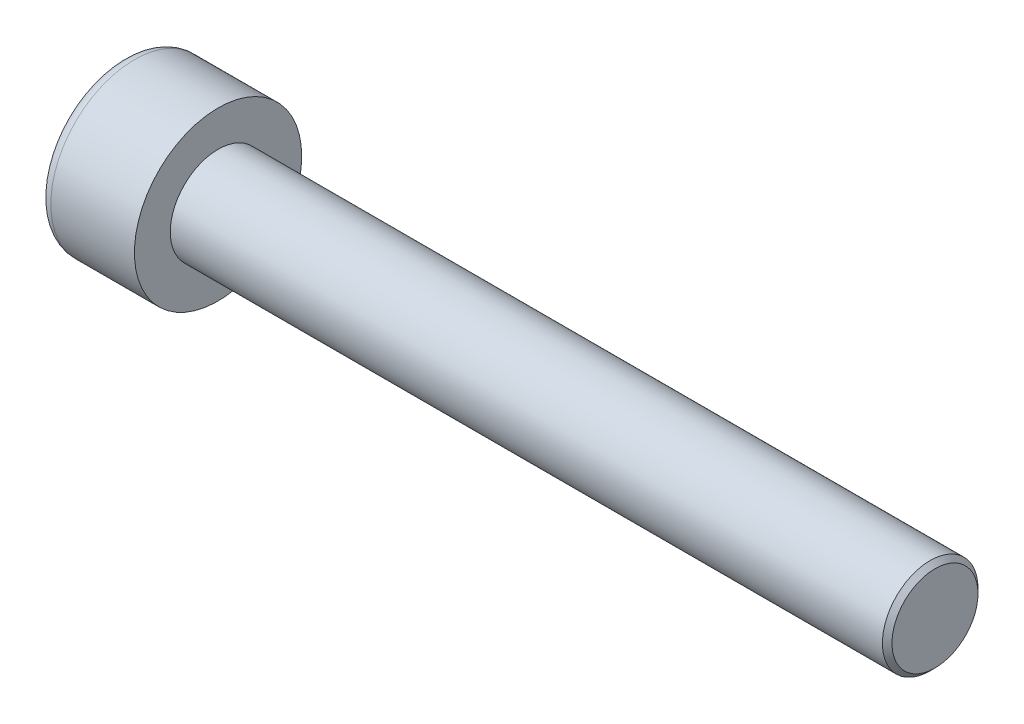
ISO-10303-21;
HEADER;
FILE_DESCRIPTION(('STEP AP214'),'2;1');
FILE_NAME('part.step','',(''),(''),'','','');
FILE_SCHEMA(('AUTOMOTIVE_DESIGN { 1 0 10303 214 1 1 1 1 }'));
ENDSEC;
DATA;
#1=APPLICATION_CONTEXT('core data for automotive mechanical design processes');
#2=APPLICATION_PROTOCOL_DEFINITION('international standard','automotive_design',2000,#1);
#3=PRODUCT_CONTEXT('',#1,'mechanical');
#4=PRODUCT('Part','Part','',(#3));
#5=PRODUCT_RELATED_PRODUCT_CATEGORY('part','',(#4));
#6=PRODUCT_DEFINITION_FORMATION('','',#4);
#7=PRODUCT_DEFINITION_CONTEXT('part definition',#1,'design');
#8=PRODUCT_DEFINITION('design','',#6,#7);
#9=PRODUCT_DEFINITION_SHAPE('','',#8);
#10=(LENGTH_UNIT() NAMED_UNIT(*) SI_UNIT(.MILLI.,.METRE.));
#11=(NAMED_UNIT(*) PLANE_ANGLE_UNIT() SI_UNIT($,.RADIAN.));
#12=(NAMED_UNIT(*) SI_UNIT($,.STERADIAN.) SOLID_ANGLE_UNIT());
#13=UNCERTAINTY_MEASURE_WITH_UNIT(LENGTH_MEASURE(1.E-05),#10,'distance_accuracy_value','');
#14=(GEOMETRIC_REPRESENTATION_CONTEXT(3) GLOBAL_UNCERTAINTY_ASSIGNED_CONTEXT((#13)) GLOBAL_UNIT_ASSIGNED_CONTEXT((#10,
#11,#12)) REPRESENTATION_CONTEXT('',''));
#15=CARTESIAN_POINT('',(0.,0.,0.));
#16=DIRECTION('',(0.,0.,1.));
#17=DIRECTION('',(1.,0.,0.));
#18=AXIS2_PLACEMENT_3D('',#15,#16,#17);
#19=CARTESIAN_POINT('',(2.,1.5,-2.59807621135331));
#20=DIRECTION('',(1.,0.,0.));
#21=DIRECTION('',(0.,0.,-1.));
#22=AXIS2_PLACEMENT_3D('',#19,#20,#21);
#23=PLANE('',#22);
#24=CARTESIAN_POINT('',(2.,0.,0.));
#25=DIRECTION('',(1.,0.,0.));
#26=DIRECTION('',(0.,0.,-1.));
#27=AXIS2_PLACEMENT_3D('',#24,#25,#26);
#28=CIRCLE('',#27,1.5);
#29=CARTESIAN_POINT('',(2.,-0.75,-1.29903810567666));
#30=VERTEX_POINT('',#29);
#31=CARTESIAN_POINT('',(2.,-1.5,0.));
#32=VERTEX_POINT('',#31);
#33=EDGE_CURVE('E172',#30,#32,#28,.F.);
#34=ORIENTED_EDGE('',*,*,#33,.F.);
#35=DIRECTION('',(0.,0.866025403784439,-0.5));
#36=VECTOR('',#35,1.);
#37=CARTESIAN_POINT('',(2.,-1.5,-0.866025403784437));
#38=LINE('',#37,#36);
#39=CARTESIAN_POINT('',(2.,-1.5,-0.866025403784437));
#40=VERTEX_POINT('',#39);
#41=EDGE_CURVE('E181',#40,#30,#38,.T.);
#42=ORIENTED_EDGE('',*,*,#41,.F.);
#43=DIRECTION('',(0.,0.,-1.));
#44=VECTOR('',#43,1.);
#45=CARTESIAN_POINT('',(2.,-1.5,0.86602540378444));
#46=LINE('',#45,#44);
#47=EDGE_CURVE('E203',#32,#40,#46,.T.);
#48=ORIENTED_EDGE('',*,*,#47,.F.);
#49=EDGE_LOOP('',(#34,#42,#48));
#50=FACE_BOUND('',#49,.T.);
#51=ADVANCED_FACE('F47',(#50),#23,.F.);
#52=CARTESIAN_POINT('',(2.,-0.75,1.29903810567666));
#53=VERTEX_POINT('',#52);
#54=EDGE_CURVE('E330',#32,#53,#28,.F.);
#55=ORIENTED_EDGE('',*,*,#54,.F.);
#56=CARTESIAN_POINT('',(2.,-1.5,0.86602540378444));
#57=VERTEX_POINT('',#56);
#58=EDGE_CURVE('E204',#57,#32,#46,.T.);
#59=ORIENTED_EDGE('',*,*,#58,.F.);
#60=DIRECTION('',(0.,-0.866025403784438,-0.5));
#61=VECTOR('',#60,1.);
#62=CARTESIAN_POINT('',(2.,0.,1.73205080756888));
#63=LINE('',#62,#61);
#64=EDGE_CURVE('E198',#53,#57,#63,.T.);
#65=ORIENTED_EDGE('',*,*,#64,.F.);
#66=EDGE_LOOP('',(#55,#59,#65));
#67=FACE_BOUND('',#66,.T.);
#68=ADVANCED_FACE('F137',(#67),#23,.F.);
#69=CARTESIAN_POINT('',(2.,0.75,1.29903810567666));
#70=VERTEX_POINT('',#69);
#71=EDGE_CURVE('E328',#53,#70,#28,.F.);
#72=ORIENTED_EDGE('',*,*,#71,.F.);
#73=CARTESIAN_POINT('',(2.,0.,1.73205080756888));
#74=VERTEX_POINT('',#73);
#75=EDGE_CURVE('E199',#74,#53,#63,.T.);
#76=ORIENTED_EDGE('',*,*,#75,.F.);
#77=DIRECTION('',(0.,-0.866025403784438,0.5));
#78=VECTOR('',#77,1.);
#79=CARTESIAN_POINT('',(2.,1.5,0.86602540378444));
#80=LINE('',#79,#78);
#81=EDGE_CURVE('E193',#70,#74,#80,.T.);
#82=ORIENTED_EDGE('',*,*,#81,.F.);
#83=EDGE_LOOP('',(#72,#76,#82));
#84=FACE_BOUND('',#83,.T.);
#85=ADVANCED_FACE('F143',(#84),#23,.F.);
#86=CARTESIAN_POINT('',(2.,1.5,0.));
#87=VERTEX_POINT('',#86);
#88=EDGE_CURVE('E169',#70,#87,#28,.F.);
#89=ORIENTED_EDGE('',*,*,#88,.F.);
#90=CARTESIAN_POINT('',(2.,1.5,0.86602540378444));
#91=VERTEX_POINT('',#90);
#92=EDGE_CURVE('E194',#91,#70,#80,.T.);
#93=ORIENTED_EDGE('',*,*,#92,.F.);
#94=DIRECTION('',(0.,0.,1.));
#95=VECTOR('',#94,1.);
#96=CARTESIAN_POINT('',(2.,1.5,-0.866025403784437));
#97=LINE('',#96,#95);
#98=EDGE_CURVE('E186',#87,#91,#97,.T.);
#99=ORIENTED_EDGE('',*,*,#98,.F.);
#100=EDGE_LOOP('',(#89,#93,#99));
#101=FACE_BOUND('',#100,.T.);
#102=ADVANCED_FACE('F157',(#101),#23,.F.);
#103=CARTESIAN_POINT('',(2.,0.,0.));
#104=DIRECTION('',(1.,0.,0.));
#105=DIRECTION('',(0.,0.,-1.));
#106=AXIS2_PLACEMENT_3D('',#103,#104,#105);
#107=CIRCLE('',#106,1.5);
#108=CARTESIAN_POINT('',(2.,0.749999999999999,-1.29903810567666));
#109=VERTEX_POINT('',#108);
#110=EDGE_CURVE('E63',#109,#87,#107,.T.);
#111=ORIENTED_EDGE('',*,*,#110,.T.);
#112=CARTESIAN_POINT('',(2.,1.5,-0.866025403784437));
#113=VERTEX_POINT('',#112);
#114=EDGE_CURVE('E177',#113,#87,#97,.T.);
#115=ORIENTED_EDGE('',*,*,#114,.F.);
#116=DIRECTION('',(0.,0.866025403784438,0.5));
#117=VECTOR('',#116,1.);
#118=CARTESIAN_POINT('',(2.,0.,-1.73205080756888));
#119=LINE('',#118,#117);
#120=EDGE_CURVE('E174',#109,#113,#119,.T.);
#121=ORIENTED_EDGE('',*,*,#120,.F.);
#122=EDGE_LOOP('',(#111,#115,#121));
#123=FACE_BOUND('',#122,.T.);
#124=ADVANCED_FACE('F148',(#123),#23,.F.);
#125=EDGE_CURVE('E161',#109,#30,#28,.F.);
#126=ORIENTED_EDGE('',*,*,#125,.F.);
#127=CARTESIAN_POINT('',(2.,0.,-1.73205080756888));
#128=VERTEX_POINT('',#127);
#129=EDGE_CURVE('E164',#128,#109,#119,.T.);
#130=ORIENTED_EDGE('',*,*,#129,.F.);
#131=EDGE_CURVE('E166',#30,#128,#38,.T.);
#132=ORIENTED_EDGE('',*,*,#131,.F.);
#133=EDGE_LOOP('',(#126,#130,#132));
#134=FACE_BOUND('',#133,.T.);
#135=ADVANCED_FACE('F139',(#134),#23,.F.);
#136=CARTESIAN_POINT('',(0.,0.,0.));
#137=DIRECTION('',(1.,0.,0.));
#138=DIRECTION('',(0.,0.,-1.));
#139=AXIS2_PLACEMENT_3D('',#136,#137,#138);
#140=PLANE('',#139);
#141=CARTESIAN_POINT('',(0.,0.,0.));
#142=DIRECTION('',(1.,0.,0.));
#143=DIRECTION('',(0.,0.,-1.));
#144=AXIS2_PLACEMENT_3D('',#141,#142,#143);
#145=CIRCLE('',#144,3.);
#146=CARTESIAN_POINT('',(0.,0.,-3.));
#147=VERTEX_POINT('',#146);
#148=EDGE_CURVE('E258',#147,#147,#145,.F.);
#149=ORIENTED_EDGE('',*,*,#148,.T.);
#150=EDGE_LOOP('',(#149));
#151=FACE_BOUND('',#150,.T.);
#152=DIRECTION('',(0.,0.866025403784439,-0.5));
#153=VECTOR('',#152,1.);
#154=CARTESIAN_POINT('',(0.,-1.5,-0.866025403784437));
#155=LINE('',#154,#153);
#156=CARTESIAN_POINT('',(0.,-1.5,-0.866025403784437));
#157=VERTEX_POINT('',#156);
#158=CARTESIAN_POINT('',(0.,0.,-1.73205080756888));
#159=VERTEX_POINT('',#158);
#160=EDGE_CURVE('E71',#157,#159,#155,.T.);
#161=ORIENTED_EDGE('',*,*,#160,.T.);
#162=DIRECTION('',(0.,0.866025403784438,0.5));
#163=VECTOR('',#162,1.);
#164=CARTESIAN_POINT('',(0.,0.,-1.73205080756888));
#165=LINE('',#164,#163);
#166=CARTESIAN_POINT('',(0.,1.5,-0.866025403784437));
#167=VERTEX_POINT('',#166);
#168=EDGE_CURVE('E211',#159,#167,#165,.T.);
#169=ORIENTED_EDGE('',*,*,#168,.T.);
#170=DIRECTION('',(0.,0.,1.));
#171=VECTOR('',#170,1.);
#172=CARTESIAN_POINT('',(0.,1.5,-0.866025403784437));
#173=LINE('',#172,#171);
#174=CARTESIAN_POINT('',(0.,1.5,0.86602540378444));
#175=VERTEX_POINT('',#174);
#176=EDGE_CURVE('E215',#167,#175,#173,.T.);
#177=ORIENTED_EDGE('',*,*,#176,.T.);
#178=DIRECTION('',(0.,-0.866025403784438,0.5));
#179=VECTOR('',#178,1.);
#180=CARTESIAN_POINT('',(0.,1.5,0.86602540378444));
#181=LINE('',#180,#179);
#182=CARTESIAN_POINT('',(0.,0.,1.73205080756888));
#183=VERTEX_POINT('',#182);
#184=EDGE_CURVE('E219',#175,#183,#181,.T.);
#185=ORIENTED_EDGE('',*,*,#184,.T.);
#186=DIRECTION('',(0.,-0.866025403784438,-0.5));
#187=VECTOR('',#186,1.);
#188=CARTESIAN_POINT('',(0.,0.,1.73205080756888));
#189=LINE('',#188,#187);
#190=CARTESIAN_POINT('',(0.,-1.5,0.86602540378444));
#191=VERTEX_POINT('',#190);
#192=EDGE_CURVE('E223',#183,#191,#189,.T.);
#193=ORIENTED_EDGE('',*,*,#192,.T.);
#194=DIRECTION('',(0.,0.,-1.));
#195=VECTOR('',#194,1.);
#196=CARTESIAN_POINT('',(0.,-1.5,0.86602540378444));
#197=LINE('',#196,#195);
#198=EDGE_CURVE('E227',#191,#157,#197,.T.);
#199=ORIENTED_EDGE('',*,*,#198,.T.);
#200=EDGE_LOOP('',(#161,#169,#177,#185,#193,#199));
#201=FACE_BOUND('',#200,.T.);
#202=ADVANCED_FACE('F147',(#151,#201),#140,.F.);
#203=CARTESIAN_POINT('',(4.,0.,0.));
#204=DIRECTION('',(1.,0.,0.));
#205=DIRECTION('',(0.,0.,-1.));
#206=AXIS2_PLACEMENT_3D('',#203,#204,#205);
#207=PLANE('',#206);
#208=CARTESIAN_POINT('',(4.,0.,0.));
#209=DIRECTION('',(1.,0.,0.));
#210=DIRECTION('',(0.,0.,-1.));
#211=AXIS2_PLACEMENT_3D('',#208,#209,#210);
#212=CIRCLE('',#211,3.5);
#213=CARTESIAN_POINT('',(4.,0.,-3.5));
#214=VERTEX_POINT('',#213);
#215=EDGE_CURVE('E170',#214,#214,#212,.T.);
#216=ORIENTED_EDGE('',*,*,#215,.T.);
#217=EDGE_LOOP('',(#216));
#218=FACE_BOUND('',#217,.T.);
#219=CARTESIAN_POINT('',(4.,0.,0.));
#220=DIRECTION('',(1.,0.,0.));
#221=DIRECTION('',(0.,0.,-1.));
#222=AXIS2_PLACEMENT_3D('',#219,#220,#221);
#223=CIRCLE('',#222,2.);
#224=CARTESIAN_POINT('',(4.,0.,-2.));
#225=VERTEX_POINT('',#224);
#226=EDGE_CURVE('E247',#225,#225,#223,.T.);
#227=ORIENTED_EDGE('',*,*,#226,.F.);
#228=EDGE_LOOP('',(#227));
#229=FACE_BOUND('',#228,.T.);
#230=ADVANCED_FACE('F154',(#218,#229),#207,.T.);
#231=CARTESIAN_POINT('',(4.,0.,0.));
#232=DIRECTION('',(-1.,0.,0.));
#233=DIRECTION('',(0.,0.,1.));
#234=AXIS2_PLACEMENT_3D('',#231,#232,#233);
#235=CYLINDRICAL_SURFACE('',#234,3.5);
#236=CARTESIAN_POINT('',(0.5,0.,0.));
#237=DIRECTION('',(1.,0.,0.));
#238=DIRECTION('',(0.,0.,-1.));
#239=AXIS2_PLACEMENT_3D('',#236,#237,#238);
#240=CIRCLE('',#239,3.5);
#241=CARTESIAN_POINT('',(0.5,0.,-3.5));
#242=VERTEX_POINT('',#241);
#243=EDGE_CURVE('E254',#242,#242,#240,.T.);
#244=ORIENTED_EDGE('',*,*,#243,.T.);
#245=EDGE_LOOP('',(#244));
#246=FACE_BOUND('',#245,.T.);
#247=ORIENTED_EDGE('',*,*,#215,.F.);
#248=EDGE_LOOP('',(#247));
#249=FACE_BOUND('',#248,.T.);
#250=ADVANCED_FACE('F276',(#246,#249),#235,.T.);
#251=CARTESIAN_POINT('',(34.,0.,0.));
#252=DIRECTION('',(-1.,0.,0.));
#253=DIRECTION('',(0.,0.,1.));
#254=AXIS2_PLACEMENT_3D('',#251,#252,#253);
#255=CYLINDRICAL_SURFACE('',#254,2.);
#256=CARTESIAN_POINT('',(33.8,0.,0.));
#257=DIRECTION('',(1.,0.,0.));
#258=DIRECTION('',(0.,0.,-1.));
#259=AXIS2_PLACEMENT_3D('',#256,#257,#258);
#260=CIRCLE('',#259,2.);
#261=CARTESIAN_POINT('',(33.8,0.,-2.));
#262=VERTEX_POINT('',#261);
#263=EDGE_CURVE('E11',#262,#262,#260,.F.);
#264=ORIENTED_EDGE('',*,*,#263,.T.);
#265=EDGE_LOOP('',(#264));
#266=FACE_BOUND('',#265,.T.);
#267=ORIENTED_EDGE('',*,*,#226,.T.);
#268=EDGE_LOOP('',(#267));
#269=FACE_BOUND('',#268,.T.);
#270=ADVANCED_FACE('F273',(#266,#269),#255,.T.);
#271=CARTESIAN_POINT('',(34.,0.,0.));
#272=DIRECTION('',(1.,0.,0.));
#273=DIRECTION('',(0.,0.,-1.));
#274=AXIS2_PLACEMENT_3D('',#271,#272,#273);
#275=PLANE('',#274);
#276=CARTESIAN_POINT('',(34.,0.,0.));
#277=DIRECTION('',(1.,0.,0.));
#278=DIRECTION('',(0.,0.,-1.));
#279=AXIS2_PLACEMENT_3D('',#276,#277,#278);
#280=CIRCLE('',#279,1.8);
#281=CARTESIAN_POINT('',(34.,0.,-1.8));
#282=VERTEX_POINT('',#281);
#283=EDGE_CURVE('E56',#282,#282,#280,.T.);
#284=ORIENTED_EDGE('',*,*,#283,.T.);
#285=EDGE_LOOP('',(#284));
#286=FACE_BOUND('',#285,.T.);
#287=ADVANCED_FACE('F265',(#286),#275,.T.);
#288=CARTESIAN_POINT('',(2.,-1.5,-0.866025403784437));
#289=DIRECTION('',(0.,0.5,0.866025403784439));
#290=DIRECTION('',(0.,-0.866025403784439,0.5));
#291=AXIS2_PLACEMENT_3D('',#288,#289,#290);
#292=PLANE('',#291);
#293=ORIENTED_EDGE('',*,*,#160,.F.);
#294=DIRECTION('',(-1.,0.,0.));
#295=VECTOR('',#294,1.);
#296=CARTESIAN_POINT('',(2.,-1.5,-0.866025403784437));
#297=LINE('',#296,#295);
#298=EDGE_CURVE('E208',#40,#157,#297,.T.);
#299=ORIENTED_EDGE('',*,*,#298,.F.);
#300=ORIENTED_EDGE('',*,*,#41,.T.);
#301=ORIENTED_EDGE('',*,*,#131,.T.);
#302=DIRECTION('',(-1.,0.,0.));
#303=VECTOR('',#302,1.);
#304=CARTESIAN_POINT('',(2.,0.,-1.73205080756888));
#305=LINE('',#304,#303);
#306=EDGE_CURVE('E184',#128,#159,#305,.T.);
#307=ORIENTED_EDGE('',*,*,#306,.T.);
#308=EDGE_LOOP('',(#293,#299,#300,#301,#307));
#309=FACE_BOUND('',#308,.T.);
#310=ADVANCED_FACE('F291',(#309),#292,.T.);
#311=CARTESIAN_POINT('',(2.,0.,-1.73205080756888));
#312=DIRECTION('',(0.,-0.5,0.866025403784439));
#313=DIRECTION('',(0.,-0.866025403784438,-0.5));
#314=AXIS2_PLACEMENT_3D('',#311,#312,#313);
#315=PLANE('',#314);
#316=ORIENTED_EDGE('',*,*,#168,.F.);
#317=ORIENTED_EDGE('',*,*,#306,.F.);
#318=ORIENTED_EDGE('',*,*,#129,.T.);
#319=ORIENTED_EDGE('',*,*,#120,.T.);
#320=DIRECTION('',(-1.,0.,0.));
#321=VECTOR('',#320,1.);
#322=CARTESIAN_POINT('',(2.,1.5,-0.866025403784437));
#323=LINE('',#322,#321);
#324=EDGE_CURVE('E242',#113,#167,#323,.T.);
#325=ORIENTED_EDGE('',*,*,#324,.T.);
#326=EDGE_LOOP('',(#316,#317,#318,#319,#325));
#327=FACE_BOUND('',#326,.T.);
#328=ADVANCED_FACE('F183',(#327),#315,.T.);
#329=CARTESIAN_POINT('',(2.,1.5,-0.866025403784437));
#330=DIRECTION('',(0.,-1.,0.));
#331=DIRECTION('',(0.,0.,-1.));
#332=AXIS2_PLACEMENT_3D('',#329,#330,#331);
#333=PLANE('',#332);
#334=ORIENTED_EDGE('',*,*,#176,.F.);
#335=ORIENTED_EDGE('',*,*,#324,.F.);
#336=ORIENTED_EDGE('',*,*,#114,.T.);
#337=ORIENTED_EDGE('',*,*,#98,.T.);
#338=DIRECTION('',(-1.,0.,0.));
#339=VECTOR('',#338,1.);
#340=CARTESIAN_POINT('',(2.,1.5,0.86602540378444));
#341=LINE('',#340,#339);
#342=EDGE_CURVE('E239',#91,#175,#341,.T.);
#343=ORIENTED_EDGE('',*,*,#342,.T.);
#344=EDGE_LOOP('',(#334,#335,#336,#337,#343));
#345=FACE_BOUND('',#344,.T.);
#346=ADVANCED_FACE('F296',(#345),#333,.T.);
#347=CARTESIAN_POINT('',(2.,1.5,0.86602540378444));
#348=DIRECTION('',(0.,-0.5,-0.866025403784439));
#349=DIRECTION('',(0.,0.866025403784439,-0.5));
#350=AXIS2_PLACEMENT_3D('',#347,#348,#349);
#351=PLANE('',#350);
#352=ORIENTED_EDGE('',*,*,#184,.F.);
#353=ORIENTED_EDGE('',*,*,#342,.F.);
#354=ORIENTED_EDGE('',*,*,#92,.T.);
#355=ORIENTED_EDGE('',*,*,#81,.T.);
#356=DIRECTION('',(-1.,0.,0.));
#357=VECTOR('',#356,1.);
#358=CARTESIAN_POINT('',(2.,0.,1.73205080756888));
#359=LINE('',#358,#357);
#360=EDGE_CURVE('E236',#74,#183,#359,.T.);
#361=ORIENTED_EDGE('',*,*,#360,.T.);
#362=EDGE_LOOP('',(#352,#353,#354,#355,#361));
#363=FACE_BOUND('',#362,.T.);
#364=ADVANCED_FACE('F299',(#363),#351,.T.);
#365=CARTESIAN_POINT('',(2.,0.,1.73205080756888));
#366=DIRECTION('',(0.,0.5,-0.866025403784439));
#367=DIRECTION('',(0.,0.866025403784438,0.5));
#368=AXIS2_PLACEMENT_3D('',#365,#366,#367);
#369=PLANE('',#368);
#370=ORIENTED_EDGE('',*,*,#192,.F.);
#371=ORIENTED_EDGE('',*,*,#360,.F.);
#372=ORIENTED_EDGE('',*,*,#75,.T.);
#373=ORIENTED_EDGE('',*,*,#64,.T.);
#374=DIRECTION('',(-1.,0.,0.));
#375=VECTOR('',#374,1.);
#376=CARTESIAN_POINT('',(2.,-1.5,0.86602540378444));
#377=LINE('',#376,#375);
#378=EDGE_CURVE('E233',#57,#191,#377,.T.);
#379=ORIENTED_EDGE('',*,*,#378,.T.);
#380=EDGE_LOOP('',(#370,#371,#372,#373,#379));
#381=FACE_BOUND('',#380,.T.);
#382=ADVANCED_FACE('F132',(#381),#369,.T.);
#383=CARTESIAN_POINT('',(2.,-1.5,0.86602540378444));
#384=DIRECTION('',(0.,1.,0.));
#385=DIRECTION('',(0.,0.,1.));
#386=AXIS2_PLACEMENT_3D('',#383,#384,#385);
#387=PLANE('',#386);
#388=ORIENTED_EDGE('',*,*,#198,.F.);
#389=ORIENTED_EDGE('',*,*,#378,.F.);
#390=ORIENTED_EDGE('',*,*,#58,.T.);
#391=ORIENTED_EDGE('',*,*,#47,.T.);
#392=ORIENTED_EDGE('',*,*,#298,.T.);
#393=EDGE_LOOP('',(#388,#389,#390,#391,#392));
#394=FACE_BOUND('',#393,.T.);
#395=ADVANCED_FACE('F125',(#394),#387,.T.);
#396=CARTESIAN_POINT('',(2.,0.,0.));
#397=DIRECTION('',(-1.,0.,0.));
#398=DIRECTION('',(0.,0.,1.));
#399=AXIS2_PLACEMENT_3D('',#396,#397,#398);
#400=CONICAL_SURFACE('',#399,1.5,1.04719755119659);
#401=CARTESIAN_POINT('',(2.86602540378445,0.,0.));
#402=VERTEX_POINT('',#401);
#403=VERTEX_LOOP('',#402);
#404=FACE_BOUND('',#403,.T.);
#405=ORIENTED_EDGE('',*,*,#110,.F.);
#406=ORIENTED_EDGE('',*,*,#125,.T.);
#407=ORIENTED_EDGE('',*,*,#33,.T.);
#408=ORIENTED_EDGE('',*,*,#54,.T.);
#409=ORIENTED_EDGE('',*,*,#71,.T.);
#410=ORIENTED_EDGE('',*,*,#88,.T.);
#411=EDGE_LOOP('',(#405,#406,#407,#408,#409,#410));
#412=FACE_BOUND('',#411,.T.);
#413=ADVANCED_FACE('F122',(#404,#412),#400,.F.);
#414=CARTESIAN_POINT('',(0.5,0.,0.));
#415=DIRECTION('',(1.,0.,0.));
#416=DIRECTION('',(0.,0.,-1.));
#417=AXIS2_PLACEMENT_3D('',#414,#415,#416);
#418=TOROIDAL_SURFACE('',#417,3.,0.5);
#419=ORIENTED_EDGE('',*,*,#148,.F.);
#420=EDGE_LOOP('',(#419));
#421=FACE_BOUND('',#420,.T.);
#422=ORIENTED_EDGE('',*,*,#243,.F.);
#423=EDGE_LOOP('',(#422));
#424=FACE_BOUND('',#423,.T.);
#425=ADVANCED_FACE('F124',(#421,#424),#418,.T.);
#426=CARTESIAN_POINT('',(34.,0.,0.));
#427=DIRECTION('',(-1.,0.,0.));
#428=DIRECTION('',(0.,0.,1.));
#429=AXIS2_PLACEMENT_3D('',#426,#427,#428);
#430=CONICAL_SURFACE('',#429,1.8,0.785398163397453);
#431=ORIENTED_EDGE('',*,*,#263,.F.);
#432=EDGE_LOOP('',(#431));
#433=FACE_BOUND('',#432,.T.);
#434=ORIENTED_EDGE('',*,*,#283,.F.);
#435=EDGE_LOOP('',(#434));
#436=FACE_BOUND('',#435,.T.);
#437=ADVANCED_FACE('F49',(#433,#436),#430,.T.);
#438=CLOSED_SHELL('',(#51,#68,#85,#102,#124,#135,#202,#230,#250,#270,#287,#310,#328,#346,#364,
#382,#395,#413,#425,#437));
#439=MANIFOLD_SOLID_BREP('B2',#438);
#440=ADVANCED_BREP_SHAPE_REPRESENTATION('',(#18,#439),#14);
#441=SHAPE_DEFINITION_REPRESENTATION(#9,#440);
ENDSEC;
END-ISO-10303-21;
